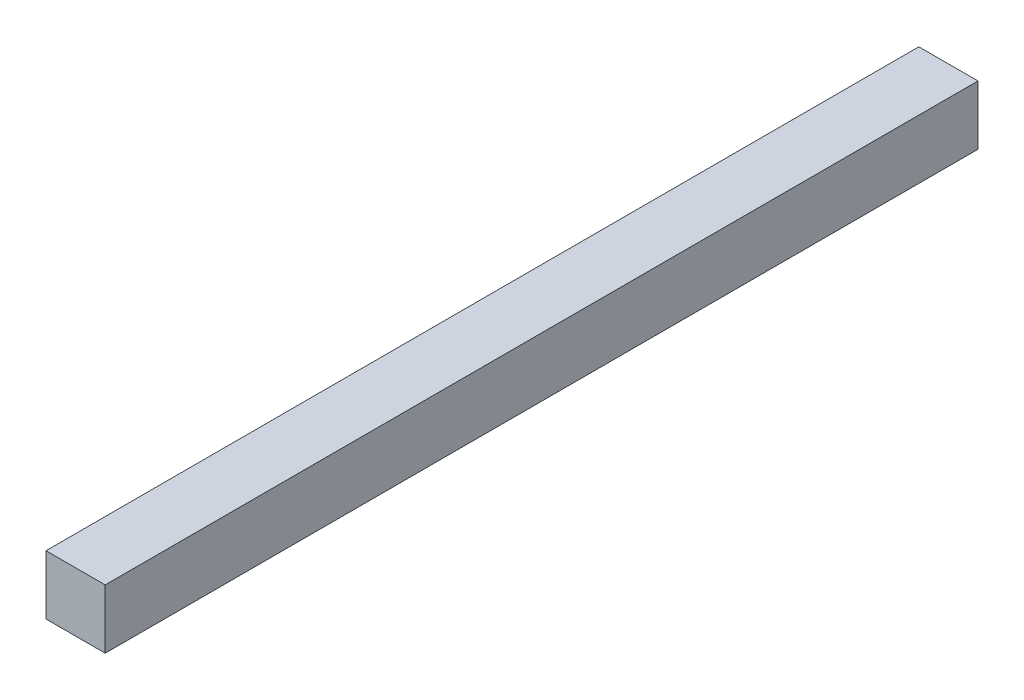
ISO-10303-21;
HEADER;
FILE_DESCRIPTION(('STEP AP214'),'2;1');
FILE_NAME('part.step','',(''),(''),'','','');
FILE_SCHEMA(('AUTOMOTIVE_DESIGN { 1 0 10303 214 1 1 1 1 }'));
ENDSEC;
DATA;
#1=APPLICATION_CONTEXT('core data for automotive mechanical design processes');
#2=APPLICATION_PROTOCOL_DEFINITION('international standard','automotive_design',2000,#1);
#3=PRODUCT_CONTEXT('',#1,'mechanical');
#4=PRODUCT('Part','Part','',(#3));
#5=PRODUCT_RELATED_PRODUCT_CATEGORY('part','',(#4));
#6=PRODUCT_DEFINITION_FORMATION('','',#4);
#7=PRODUCT_DEFINITION_CONTEXT('part definition',#1,'design');
#8=PRODUCT_DEFINITION('design','',#6,#7);
#9=PRODUCT_DEFINITION_SHAPE('','',#8);
#10=(LENGTH_UNIT() NAMED_UNIT(*) SI_UNIT(.MILLI.,.METRE.));
#11=(NAMED_UNIT(*) PLANE_ANGLE_UNIT() SI_UNIT($,.RADIAN.));
#12=(NAMED_UNIT(*) SI_UNIT($,.STERADIAN.) SOLID_ANGLE_UNIT());
#13=UNCERTAINTY_MEASURE_WITH_UNIT(LENGTH_MEASURE(1.E-05),#10,'distance_accuracy_value','');
#14=(GEOMETRIC_REPRESENTATION_CONTEXT(3) GLOBAL_UNCERTAINTY_ASSIGNED_CONTEXT((#13)) GLOBAL_UNIT_ASSIGNED_CONTEXT((#10,
#11,#12)) REPRESENTATION_CONTEXT('',''));
#15=CARTESIAN_POINT('',(0.,0.,0.));
#16=DIRECTION('',(0.,0.,1.));
#17=DIRECTION('',(1.,0.,0.));
#18=AXIS2_PLACEMENT_3D('',#15,#16,#17);
#19=CARTESIAN_POINT('',(-40.,0.,147.5));
#20=DIRECTION('',(-1.,0.,0.));
#21=DIRECTION('',(0.,-1.,0.));
#22=AXIS2_PLACEMENT_3D('',#19,#20,#21);
#23=PLANE('',#22);
#24=DIRECTION('',(0.,1.,0.));
#25=VECTOR('',#24,1.);
#26=CARTESIAN_POINT('',(-40.,0.,0.));
#27=LINE('',#26,#25);
#28=CARTESIAN_POINT('',(-40.,-10.,0.));
#29=VERTEX_POINT('',#28);
#30=CARTESIAN_POINT('',(-40.,0.,0.));
#31=VERTEX_POINT('',#30);
#32=EDGE_CURVE('E98',#29,#31,#27,.T.);
#33=ORIENTED_EDGE('',*,*,#32,.T.);
#34=DIRECTION('',(0.,0.,-1.));
#35=VECTOR('',#34,1.);
#36=CARTESIAN_POINT('',(-40.,0.,147.5));
#37=LINE('',#36,#35);
#38=CARTESIAN_POINT('',(-40.,0.,147.5));
#39=VERTEX_POINT('',#38);
#40=EDGE_CURVE('E11',#39,#31,#37,.T.);
#41=ORIENTED_EDGE('',*,*,#40,.F.);
#42=DIRECTION('',(0.,1.,0.));
#43=VECTOR('',#42,1.);
#44=CARTESIAN_POINT('',(-40.,0.,147.5));
#45=LINE('',#44,#43);
#46=CARTESIAN_POINT('',(-40.,-10.,147.5));
#47=VERTEX_POINT('',#46);
#48=EDGE_CURVE('E84',#47,#39,#45,.T.);
#49=ORIENTED_EDGE('',*,*,#48,.F.);
#50=DIRECTION('',(0.,0.,-1.));
#51=VECTOR('',#50,1.);
#52=CARTESIAN_POINT('',(-40.,-10.,147.5));
#53=LINE('',#52,#51);
#54=EDGE_CURVE('E51',#47,#29,#53,.T.);
#55=ORIENTED_EDGE('',*,*,#54,.T.);
#56=EDGE_LOOP('',(#33,#41,#49,#55));
#57=FACE_BOUND('',#56,.T.);
#58=ADVANCED_FACE('F35',(#57),#23,.F.);
#59=CARTESIAN_POINT('',(0.,0.,147.5));
#60=DIRECTION('',(0.,-1.,0.));
#61=DIRECTION('',(1.,0.,0.));
#62=AXIS2_PLACEMENT_3D('',#59,#60,#61);
#63=PLANE('',#62);
#64=DIRECTION('',(-1.,0.,0.));
#65=VECTOR('',#64,1.);
#66=CARTESIAN_POINT('',(0.,0.,0.));
#67=LINE('',#66,#65);
#68=CARTESIAN_POINT('',(-50.,0.,0.));
#69=VERTEX_POINT('',#68);
#70=EDGE_CURVE('E89',#31,#69,#67,.T.);
#71=ORIENTED_EDGE('',*,*,#70,.T.);
#72=DIRECTION('',(0.,0.,-1.));
#73=VECTOR('',#72,1.);
#74=CARTESIAN_POINT('',(-50.,0.,147.5));
#75=LINE('',#74,#73);
#76=CARTESIAN_POINT('',(-50.,0.,147.5));
#77=VERTEX_POINT('',#76);
#78=EDGE_CURVE('E43',#77,#69,#75,.T.);
#79=ORIENTED_EDGE('',*,*,#78,.F.);
#80=DIRECTION('',(-1.,0.,0.));
#81=VECTOR('',#80,1.);
#82=CARTESIAN_POINT('',(0.,0.,147.5));
#83=LINE('',#82,#81);
#84=EDGE_CURVE('E77',#39,#77,#83,.T.);
#85=ORIENTED_EDGE('',*,*,#84,.F.);
#86=ORIENTED_EDGE('',*,*,#40,.T.);
#87=EDGE_LOOP('',(#71,#79,#85,#86));
#88=FACE_BOUND('',#87,.T.);
#89=ADVANCED_FACE('F88',(#88),#63,.F.);
#90=CARTESIAN_POINT('',(-50.,0.,147.5));
#91=DIRECTION('',(1.,0.,0.));
#92=DIRECTION('',(0.,0.,-1.));
#93=AXIS2_PLACEMENT_3D('',#90,#91,#92);
#94=PLANE('',#93);
#95=DIRECTION('',(0.,-1.,0.));
#96=VECTOR('',#95,1.);
#97=CARTESIAN_POINT('',(-50.,0.,0.));
#98=LINE('',#97,#96);
#99=CARTESIAN_POINT('',(-50.,-10.,0.));
#100=VERTEX_POINT('',#99);
#101=EDGE_CURVE('E101',#69,#100,#98,.T.);
#102=ORIENTED_EDGE('',*,*,#101,.T.);
#103=DIRECTION('',(0.,0.,-1.));
#104=VECTOR('',#103,1.);
#105=CARTESIAN_POINT('',(-50.,-10.,147.5));
#106=LINE('',#105,#104);
#107=CARTESIAN_POINT('',(-50.,-10.,147.5));
#108=VERTEX_POINT('',#107);
#109=EDGE_CURVE('E66',#108,#100,#106,.T.);
#110=ORIENTED_EDGE('',*,*,#109,.F.);
#111=DIRECTION('',(0.,-1.,0.));
#112=VECTOR('',#111,1.);
#113=CARTESIAN_POINT('',(-50.,0.,147.5));
#114=LINE('',#113,#112);
#115=EDGE_CURVE('E83',#77,#108,#114,.T.);
#116=ORIENTED_EDGE('',*,*,#115,.F.);
#117=ORIENTED_EDGE('',*,*,#78,.T.);
#118=EDGE_LOOP('',(#102,#110,#116,#117));
#119=FACE_BOUND('',#118,.T.);
#120=ADVANCED_FACE('F92',(#119),#94,.F.);
#121=CARTESIAN_POINT('',(0.,-10.,147.5));
#122=DIRECTION('',(0.,-1.,0.));
#123=DIRECTION('',(1.,0.,0.));
#124=AXIS2_PLACEMENT_3D('',#121,#122,#123);
#125=PLANE('',#124);
#126=DIRECTION('',(-1.,0.,0.));
#127=VECTOR('',#126,1.);
#128=CARTESIAN_POINT('',(0.,-10.,0.));
#129=LINE('',#128,#127);
#130=EDGE_CURVE('E103',#29,#100,#129,.T.);
#131=ORIENTED_EDGE('',*,*,#130,.F.);
#132=ORIENTED_EDGE('',*,*,#54,.F.);
#133=DIRECTION('',(-1.,0.,0.));
#134=VECTOR('',#133,1.);
#135=CARTESIAN_POINT('',(0.,-10.,147.5));
#136=LINE('',#135,#134);
#137=EDGE_CURVE('E93',#47,#108,#136,.T.);
#138=ORIENTED_EDGE('',*,*,#137,.T.);
#139=ORIENTED_EDGE('',*,*,#109,.T.);
#140=EDGE_LOOP('',(#131,#132,#138,#139));
#141=FACE_BOUND('',#140,.T.);
#142=ADVANCED_FACE('F109',(#141),#125,.T.);
#143=CARTESIAN_POINT('',(0.,0.,147.5));
#144=DIRECTION('',(0.,0.,1.));
#145=DIRECTION('',(1.,0.,0.));
#146=AXIS2_PLACEMENT_3D('',#143,#144,#145);
#147=PLANE('',#146);
#148=ORIENTED_EDGE('',*,*,#48,.T.);
#149=ORIENTED_EDGE('',*,*,#84,.T.);
#150=ORIENTED_EDGE('',*,*,#115,.T.);
#151=ORIENTED_EDGE('',*,*,#137,.F.);
#152=EDGE_LOOP('',(#148,#149,#150,#151));
#153=FACE_BOUND('',#152,.T.);
#154=ADVANCED_FACE('F80',(#153),#147,.T.);
#155=CARTESIAN_POINT('',(0.,0.,0.));
#156=DIRECTION('',(0.,0.,1.));
#157=DIRECTION('',(1.,0.,0.));
#158=AXIS2_PLACEMENT_3D('',#155,#156,#157);
#159=PLANE('',#158);
#160=ORIENTED_EDGE('',*,*,#32,.F.);
#161=ORIENTED_EDGE('',*,*,#130,.T.);
#162=ORIENTED_EDGE('',*,*,#101,.F.);
#163=ORIENTED_EDGE('',*,*,#70,.F.);
#164=EDGE_LOOP('',(#160,#161,#162,#163));
#165=FACE_BOUND('',#164,.T.);
#166=ADVANCED_FACE('F108',(#165),#159,.F.);
#167=CLOSED_SHELL('',(#58,#89,#120,#142,#154,#166));
#168=MANIFOLD_SOLID_BREP('B2',#167);
#169=ADVANCED_BREP_SHAPE_REPRESENTATION('',(#18,#168),#14);
#170=SHAPE_DEFINITION_REPRESENTATION(#9,#169);
ENDSEC;
END-ISO-10303-21;
